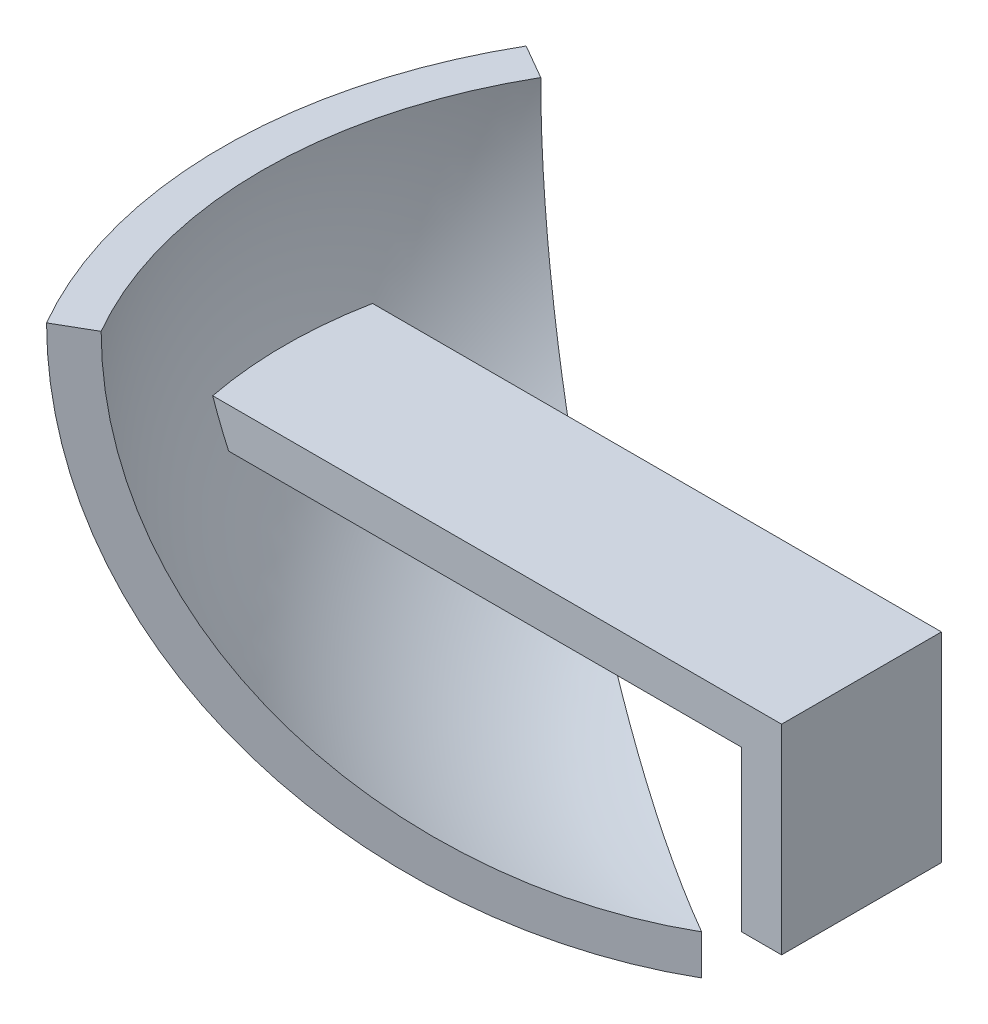
ISO-10303-21;
HEADER;
FILE_DESCRIPTION(('STEP AP214'),'2;1');
FILE_NAME('part.step','',(''),(''),'','','');
FILE_SCHEMA(('AUTOMOTIVE_DESIGN { 1 0 10303 214 1 1 1 1 }'));
ENDSEC;
DATA;
#1=APPLICATION_CONTEXT('core data for automotive mechanical design processes');
#2=APPLICATION_PROTOCOL_DEFINITION('international standard','automotive_design',2000,#1);
#3=PRODUCT_CONTEXT('',#1,'mechanical');
#4=PRODUCT('Part','Part','',(#3));
#5=PRODUCT_RELATED_PRODUCT_CATEGORY('part','',(#4));
#6=PRODUCT_DEFINITION_FORMATION('','',#4);
#7=PRODUCT_DEFINITION_CONTEXT('part definition',#1,'design');
#8=PRODUCT_DEFINITION('design','',#6,#7);
#9=PRODUCT_DEFINITION_SHAPE('','',#8);
#10=(LENGTH_UNIT() NAMED_UNIT(*) SI_UNIT(.MILLI.,.METRE.));
#11=(NAMED_UNIT(*) PLANE_ANGLE_UNIT() SI_UNIT($,.RADIAN.));
#12=(NAMED_UNIT(*) SI_UNIT($,.STERADIAN.) SOLID_ANGLE_UNIT());
#13=UNCERTAINTY_MEASURE_WITH_UNIT(LENGTH_MEASURE(1.E-05),#10,'distance_accuracy_value','');
#14=(GEOMETRIC_REPRESENTATION_CONTEXT(3) GLOBAL_UNCERTAINTY_ASSIGNED_CONTEXT((#13)) GLOBAL_UNIT_ASSIGNED_CONTEXT((#10,
#11,#12)) REPRESENTATION_CONTEXT('',''));
#15=CARTESIAN_POINT('',(0.,0.,0.));
#16=DIRECTION('',(0.,0.,1.));
#17=DIRECTION('',(1.,0.,0.));
#18=AXIS2_PLACEMENT_3D('',#15,#16,#17);
#19=CARTESIAN_POINT('',(25.4,-28.575,12.7000000000001));
#20=DIRECTION('',(0.,1.,0.));
#21=DIRECTION('',(0.,0.,1.));
#22=AXIS2_PLACEMENT_3D('',#19,#20,#21);
#23=PLANE('',#22);
#24=DIRECTION('',(0.,0.,-1.));
#25=VECTOR('',#24,1.);
#26=CARTESIAN_POINT('',(19.05,-28.575,12.7000000000001));
#27=LINE('',#26,#25);
#28=CARTESIAN_POINT('',(19.05,-28.575,12.7000000000001));
#29=VERTEX_POINT('',#28);
#30=CARTESIAN_POINT('',(19.05,-28.575,-12.6999999999999));
#31=VERTEX_POINT('',#30);
#32=EDGE_CURVE('E129',#29,#31,#27,.T.);
#33=ORIENTED_EDGE('',*,*,#32,.F.);
#34=DIRECTION('',(-1.,0.,0.));
#35=VECTOR('',#34,1.);
#36=CARTESIAN_POINT('',(25.4,-28.575,12.7000000000001));
#37=LINE('',#36,#35);
#38=CARTESIAN_POINT('',(-62.4596019439765,-28.575,12.7000000000001));
#39=VERTEX_POINT('',#38);
#40=EDGE_CURVE('E47',#29,#39,#37,.T.);
#41=ORIENTED_EDGE('',*,*,#40,.T.);
#42=CARTESIAN_POINT('',(0.,-28.575,0.));
#43=DIRECTION('',(0.,1.,0.));
#44=DIRECTION('',(0.,0.,1.));
#45=AXIS2_PLACEMENT_3D('',#42,#43,#44);
#46=CIRCLE('',#45,63.737680182134);
#47=CARTESIAN_POINT('',(-62.4596019439766,-28.575,-12.6999999999999));
#48=VERTEX_POINT('',#47);
#49=EDGE_CURVE('E149',#48,#39,#46,.T.);
#50=ORIENTED_EDGE('',*,*,#49,.F.);
#51=DIRECTION('',(-1.,0.,0.));
#52=VECTOR('',#51,1.);
#53=CARTESIAN_POINT('',(25.4,-28.575,-12.6999999999999));
#54=LINE('',#53,#52);
#55=EDGE_CURVE('E115',#31,#48,#54,.T.);
#56=ORIENTED_EDGE('',*,*,#55,.F.);
#57=EDGE_LOOP('',(#33,#41,#50,#56));
#58=FACE_BOUND('',#57,.T.);
#59=ADVANCED_FACE('F32',(#58),#23,.F.);
#60=CARTESIAN_POINT('',(0.,0.,0.));
#61=DIRECTION('',(0.,1.,0.));
#62=DIRECTION('',(-0.866025403784438,0.,-0.500000000000001));
#63=AXIS2_PLACEMENT_3D('',#60,#61,#62);
#64=SPHERICAL_SURFACE('',#63,69.85);
#65=CARTESIAN_POINT('',(0.,0.,0.));
#66=DIRECTION('',(0.,1.,0.));
#67=DIRECTION('',(0.,0.,1.));
#68=AXIS2_PLACEMENT_3D('',#65,#66,#67);
#69=CIRCLE('',#68,69.85);
#70=CARTESIAN_POINT('',(-60.491874454343,0.,-34.9250000000001));
#71=VERTEX_POINT('',#70);
#72=CARTESIAN_POINT('',(-60.491874454343,0.,34.9250000000001));
#73=VERTEX_POINT('',#72);
#74=EDGE_CURVE('E11',#71,#73,#69,.T.);
#75=ORIENTED_EDGE('',*,*,#74,.T.);
#76=CARTESIAN_POINT('',(0.,0.,0.));
#77=DIRECTION('',(-0.500000000000001,0.,-0.866025403784438));
#78=DIRECTION('',(0.866025403784438,0.,-0.500000000000001));
#79=AXIS2_PLACEMENT_3D('',#76,#77,#78);
#80=CIRCLE('',#79,69.85);
#81=CARTESIAN_POINT('',(0.,-69.85,0.));
#82=VERTEX_POINT('',#81);
#83=EDGE_CURVE('E54',#82,#73,#80,.T.);
#84=ORIENTED_EDGE('',*,*,#83,.F.);
#85=CARTESIAN_POINT('',(0.,0.,0.));
#86=DIRECTION('',(0.500000000000001,0.,-0.866025403784438));
#87=DIRECTION('',(0.866025403784438,0.,0.500000000000001));
#88=AXIS2_PLACEMENT_3D('',#85,#86,#87);
#89=CIRCLE('',#88,69.85);
#90=EDGE_CURVE('E168',#82,#71,#89,.T.);
#91=ORIENTED_EDGE('',*,*,#90,.T.);
#92=EDGE_LOOP('',(#75,#84,#91));
#93=FACE_BOUND('',#92,.T.);
#94=CARTESIAN_POINT('',(0.,-22.225,0.));
#95=DIRECTION('',(0.,-1.,0.));
#96=DIRECTION('',(0.,0.,-1.));
#97=AXIS2_PLACEMENT_3D('',#94,#95,#96);
#98=CIRCLE('',#97,66.2198752264001);
#99=CARTESIAN_POINT('',(-64.9906291322064,-22.225,12.7000000000001));
#100=VERTEX_POINT('',#99);
#101=CARTESIAN_POINT('',(-64.9906291322065,-22.225,-12.6999999999999));
#102=VERTEX_POINT('',#101);
#103=EDGE_CURVE('E155',#100,#102,#98,.T.);
#104=ORIENTED_EDGE('',*,*,#103,.T.);
#105=CARTESIAN_POINT('',(0.,0.,-12.6999999999999));
#106=DIRECTION('',(0.,0.,1.));
#107=DIRECTION('',(1.,0.,0.));
#108=AXIS2_PLACEMENT_3D('',#105,#106,#107);
#109=CIRCLE('',#108,68.685751797589);
#110=EDGE_CURVE('E158',#102,#48,#109,.T.);
#111=ORIENTED_EDGE('',*,*,#110,.T.);
#112=ORIENTED_EDGE('',*,*,#49,.T.);
#113=CARTESIAN_POINT('',(0.,0.,12.7000000000001));
#114=DIRECTION('',(0.,0.,-1.));
#115=DIRECTION('',(-1.,0.,0.));
#116=AXIS2_PLACEMENT_3D('',#113,#114,#115);
#117=CIRCLE('',#116,68.685751797589);
#118=EDGE_CURVE('E152',#39,#100,#117,.T.);
#119=ORIENTED_EDGE('',*,*,#118,.T.);
#120=EDGE_LOOP('',(#104,#111,#112,#119));
#121=FACE_BOUND('',#120,.T.);
#122=ADVANCED_FACE('F189',(#93,#121),#64,.F.);
#123=CARTESIAN_POINT('',(0.,0.,0.));
#124=DIRECTION('',(0.,1.,0.));
#125=DIRECTION('',(-0.866025403784438,0.,-0.500000000000001));
#126=AXIS2_PLACEMENT_3D('',#123,#124,#125);
#127=SPHERICAL_SURFACE('',#126,76.2);
#128=CARTESIAN_POINT('',(0.,0.,0.));
#129=DIRECTION('',(0.500000000000001,0.,0.866025403784438));
#130=DIRECTION('',(0.866025403784438,0.,-0.500000000000001));
#131=AXIS2_PLACEMENT_3D('',#128,#129,#130);
#132=CIRCLE('',#131,76.2);
#133=CARTESIAN_POINT('',(-65.9911357683742,0.,38.1000000000001));
#134=VERTEX_POINT('',#133);
#135=CARTESIAN_POINT('',(0.,-76.2,0.));
#136=VERTEX_POINT('',#135);
#137=EDGE_CURVE('E165',#134,#136,#132,.T.);
#138=ORIENTED_EDGE('',*,*,#137,.F.);
#139=CARTESIAN_POINT('',(0.,0.,0.));
#140=DIRECTION('',(0.,1.,0.));
#141=DIRECTION('',(0.,0.,1.));
#142=AXIS2_PLACEMENT_3D('',#139,#140,#141);
#143=CIRCLE('',#142,76.2);
#144=CARTESIAN_POINT('',(-65.9911357683742,0.,-38.1000000000001));
#145=VERTEX_POINT('',#144);
#146=EDGE_CURVE('E40',#145,#134,#143,.T.);
#147=ORIENTED_EDGE('',*,*,#146,.F.);
#148=CARTESIAN_POINT('',(0.,0.,0.));
#149=DIRECTION('',(-0.500000000000001,0.,0.866025403784438));
#150=DIRECTION('',(0.866025403784438,0.,0.500000000000001));
#151=AXIS2_PLACEMENT_3D('',#148,#149,#150);
#152=CIRCLE('',#151,76.2);
#153=EDGE_CURVE('E173',#145,#136,#152,.T.);
#154=ORIENTED_EDGE('',*,*,#153,.T.);
#155=EDGE_LOOP('',(#138,#147,#154));
#156=FACE_BOUND('',#155,.T.);
#157=ADVANCED_FACE('F186',(#156),#127,.T.);
#158=CARTESIAN_POINT('',(-60.491874454343,0.,-34.9250000000001));
#159=DIRECTION('',(0.,1.,0.));
#160=DIRECTION('',(0.,0.,1.));
#161=AXIS2_PLACEMENT_3D('',#158,#159,#160);
#162=PLANE('',#161);
#163=ORIENTED_EDGE('',*,*,#146,.T.);
#164=DIRECTION('',(-0.866025403784438,0.,0.500000000000001));
#165=VECTOR('',#164,1.);
#166=CARTESIAN_POINT('',(-60.491874454343,0.,34.9250000000001));
#167=LINE('',#166,#165);
#168=EDGE_CURVE('E162',#73,#134,#167,.T.);
#169=ORIENTED_EDGE('',*,*,#168,.F.);
#170=ORIENTED_EDGE('',*,*,#74,.F.);
#171=DIRECTION('',(-0.866025403784438,0.,-0.500000000000001));
#172=VECTOR('',#171,1.);
#173=CARTESIAN_POINT('',(-60.491874454343,0.,-34.9250000000001));
#174=LINE('',#173,#172);
#175=EDGE_CURVE('E170',#71,#145,#174,.T.);
#176=ORIENTED_EDGE('',*,*,#175,.T.);
#177=EDGE_LOOP('',(#163,#169,#170,#176));
#178=FACE_BOUND('',#177,.T.);
#179=ADVANCED_FACE('F34',(#178),#162,.T.);
#180=CARTESIAN_POINT('',(0.,0.,0.));
#181=DIRECTION('',(-0.500000000000001,0.,0.866025403784438));
#182=DIRECTION('',(0.866025403784438,0.,0.500000000000001));
#183=AXIS2_PLACEMENT_3D('',#180,#181,#182);
#184=PLANE('',#183);
#185=ORIENTED_EDGE('',*,*,#90,.F.);
#186=DIRECTION('',(0.,1.,0.));
#187=VECTOR('',#186,1.);
#188=CARTESIAN_POINT('',(0.,-69.85,0.));
#189=LINE('',#188,#187);
#190=EDGE_CURVE('E176',#136,#82,#189,.T.);
#191=ORIENTED_EDGE('',*,*,#190,.F.);
#192=ORIENTED_EDGE('',*,*,#153,.F.);
#193=ORIENTED_EDGE('',*,*,#175,.F.);
#194=EDGE_LOOP('',(#185,#191,#192,#193));
#195=FACE_BOUND('',#194,.T.);
#196=ADVANCED_FACE('F188',(#195),#184,.F.);
#197=CARTESIAN_POINT('',(0.,0.,0.));
#198=DIRECTION('',(0.500000000000001,0.,0.866025403784438));
#199=DIRECTION('',(0.866025403784438,0.,-0.500000000000001));
#200=AXIS2_PLACEMENT_3D('',#197,#198,#199);
#201=PLANE('',#200);
#202=ORIENTED_EDGE('',*,*,#83,.T.);
#203=ORIENTED_EDGE('',*,*,#168,.T.);
#204=ORIENTED_EDGE('',*,*,#137,.T.);
#205=ORIENTED_EDGE('',*,*,#190,.T.);
#206=EDGE_LOOP('',(#202,#203,#204,#205));
#207=FACE_BOUND('',#206,.T.);
#208=ADVANCED_FACE('F185',(#207),#201,.T.);
#209=CARTESIAN_POINT('',(25.4,-28.575,-12.6999999999999));
#210=DIRECTION('',(0.,0.,1.));
#211=DIRECTION('',(1.,0.,0.));
#212=AXIS2_PLACEMENT_3D('',#209,#210,#211);
#213=PLANE('',#212);
#214=ORIENTED_EDGE('',*,*,#110,.F.);
#215=DIRECTION('',(-1.,0.,0.));
#216=VECTOR('',#215,1.);
#217=CARTESIAN_POINT('',(25.4,-22.225,-12.6999999999999));
#218=LINE('',#217,#216);
#219=CARTESIAN_POINT('',(25.4,-22.225,-12.6999999999999));
#220=VERTEX_POINT('',#219);
#221=EDGE_CURVE('E146',#220,#102,#218,.T.);
#222=ORIENTED_EDGE('',*,*,#221,.F.);
#223=DIRECTION('',(0.,1.,0.));
#224=VECTOR('',#223,1.);
#225=CARTESIAN_POINT('',(25.4,-28.575,-12.6999999999999));
#226=LINE('',#225,#224);
#227=CARTESIAN_POINT('',(25.4,-53.975,-12.6999999999999));
#228=VERTEX_POINT('',#227);
#229=EDGE_CURVE('E139',#228,#220,#226,.T.);
#230=ORIENTED_EDGE('',*,*,#229,.F.);
#231=DIRECTION('',(1.,0.,0.));
#232=VECTOR('',#231,1.);
#233=CARTESIAN_POINT('',(25.4,-53.975,-12.6999999999999));
#234=LINE('',#233,#232);
#235=CARTESIAN_POINT('',(19.05,-53.975,-12.6999999999999));
#236=VERTEX_POINT('',#235);
#237=EDGE_CURVE('E128',#236,#228,#234,.T.);
#238=ORIENTED_EDGE('',*,*,#237,.F.);
#239=DIRECTION('',(0.,1.,0.));
#240=VECTOR('',#239,1.);
#241=CARTESIAN_POINT('',(19.05,-53.975,-12.6999999999999));
#242=LINE('',#241,#240);
#243=EDGE_CURVE('E134',#236,#31,#242,.T.);
#244=ORIENTED_EDGE('',*,*,#243,.T.);
#245=ORIENTED_EDGE('',*,*,#55,.T.);
#246=EDGE_LOOP('',(#214,#222,#230,#238,#244,#245));
#247=FACE_BOUND('',#246,.T.);
#248=ADVANCED_FACE('F198',(#247),#213,.F.);
#249=CARTESIAN_POINT('',(25.4,-22.225,12.7000000000001));
#250=DIRECTION('',(0.,-1.,0.));
#251=DIRECTION('',(0.,0.,-1.));
#252=AXIS2_PLACEMENT_3D('',#249,#250,#251);
#253=PLANE('',#252);
#254=ORIENTED_EDGE('',*,*,#103,.F.);
#255=DIRECTION('',(-1.,0.,0.));
#256=VECTOR('',#255,1.);
#257=CARTESIAN_POINT('',(25.4,-22.225,12.7000000000001));
#258=LINE('',#257,#256);
#259=CARTESIAN_POINT('',(25.4,-22.225,12.7000000000001));
#260=VERTEX_POINT('',#259);
#261=EDGE_CURVE('E144',#260,#100,#258,.T.);
#262=ORIENTED_EDGE('',*,*,#261,.F.);
#263=DIRECTION('',(0.,0.,1.));
#264=VECTOR('',#263,1.);
#265=CARTESIAN_POINT('',(25.4,-22.225,12.7000000000001));
#266=LINE('',#265,#264);
#267=EDGE_CURVE('E111',#220,#260,#266,.T.);
#268=ORIENTED_EDGE('',*,*,#267,.F.);
#269=ORIENTED_EDGE('',*,*,#221,.T.);
#270=EDGE_LOOP('',(#254,#262,#268,#269));
#271=FACE_BOUND('',#270,.T.);
#272=ADVANCED_FACE('F194',(#271),#253,.F.);
#273=CARTESIAN_POINT('',(25.4,-28.575,12.7000000000001));
#274=DIRECTION('',(0.,0.,-1.));
#275=DIRECTION('',(-1.,0.,0.));
#276=AXIS2_PLACEMENT_3D('',#273,#274,#275);
#277=PLANE('',#276);
#278=ORIENTED_EDGE('',*,*,#118,.F.);
#279=ORIENTED_EDGE('',*,*,#40,.F.);
#280=DIRECTION('',(0.,1.,0.));
#281=VECTOR('',#280,1.);
#282=CARTESIAN_POINT('',(19.05,-53.975,12.7000000000001));
#283=LINE('',#282,#281);
#284=CARTESIAN_POINT('',(19.05,-53.975,12.7000000000001));
#285=VERTEX_POINT('',#284);
#286=EDGE_CURVE('E120',#285,#29,#283,.T.);
#287=ORIENTED_EDGE('',*,*,#286,.F.);
#288=DIRECTION('',(-1.,0.,0.));
#289=VECTOR('',#288,1.);
#290=CARTESIAN_POINT('',(25.4,-53.975,12.7000000000001));
#291=LINE('',#290,#289);
#292=CARTESIAN_POINT('',(25.4,-53.975,12.7000000000001));
#293=VERTEX_POINT('',#292);
#294=EDGE_CURVE('E118',#293,#285,#291,.T.);
#295=ORIENTED_EDGE('',*,*,#294,.F.);
#296=DIRECTION('',(0.,-1.,0.));
#297=VECTOR('',#296,1.);
#298=CARTESIAN_POINT('',(25.4,-28.575,12.7000000000001));
#299=LINE('',#298,#297);
#300=EDGE_CURVE('E105',#260,#293,#299,.T.);
#301=ORIENTED_EDGE('',*,*,#300,.F.);
#302=ORIENTED_EDGE('',*,*,#261,.T.);
#303=EDGE_LOOP('',(#278,#279,#287,#295,#301,#302));
#304=FACE_BOUND('',#303,.T.);
#305=ADVANCED_FACE('F119',(#304),#277,.F.);
#306=CARTESIAN_POINT('',(25.4,0.,0.));
#307=DIRECTION('',(-1.,0.,0.));
#308=DIRECTION('',(0.,0.,1.));
#309=AXIS2_PLACEMENT_3D('',#306,#307,#308);
#310=PLANE('',#309);
#311=ORIENTED_EDGE('',*,*,#229,.T.);
#312=ORIENTED_EDGE('',*,*,#267,.T.);
#313=ORIENTED_EDGE('',*,*,#300,.T.);
#314=DIRECTION('',(0.,0.,1.));
#315=VECTOR('',#314,1.);
#316=CARTESIAN_POINT('',(25.4,-53.975,12.7000000000001));
#317=LINE('',#316,#315);
#318=EDGE_CURVE('E110',#228,#293,#317,.T.);
#319=ORIENTED_EDGE('',*,*,#318,.F.);
#320=EDGE_LOOP('',(#311,#312,#313,#319));
#321=FACE_BOUND('',#320,.T.);
#322=ADVANCED_FACE('F108',(#321),#310,.F.);
#323=CARTESIAN_POINT('',(19.05,-53.975,12.7000000000001));
#324=DIRECTION('',(1.,0.,0.));
#325=DIRECTION('',(0.,0.,-1.));
#326=AXIS2_PLACEMENT_3D('',#323,#324,#325);
#327=PLANE('',#326);
#328=ORIENTED_EDGE('',*,*,#32,.T.);
#329=ORIENTED_EDGE('',*,*,#243,.F.);
#330=DIRECTION('',(0.,0.,-1.));
#331=VECTOR('',#330,1.);
#332=CARTESIAN_POINT('',(19.05,-53.975,12.7000000000001));
#333=LINE('',#332,#331);
#334=EDGE_CURVE('E123',#285,#236,#333,.T.);
#335=ORIENTED_EDGE('',*,*,#334,.F.);
#336=ORIENTED_EDGE('',*,*,#286,.T.);
#337=EDGE_LOOP('',(#328,#329,#335,#336));
#338=FACE_BOUND('',#337,.T.);
#339=ADVANCED_FACE('F201',(#338),#327,.F.);
#340=CARTESIAN_POINT('',(0.,-53.975,0.));
#341=DIRECTION('',(0.,1.,0.));
#342=DIRECTION('',(0.,0.,1.));
#343=AXIS2_PLACEMENT_3D('',#340,#341,#342);
#344=PLANE('',#343);
#345=ORIENTED_EDGE('',*,*,#318,.T.);
#346=ORIENTED_EDGE('',*,*,#294,.T.);
#347=ORIENTED_EDGE('',*,*,#334,.T.);
#348=ORIENTED_EDGE('',*,*,#237,.T.);
#349=EDGE_LOOP('',(#345,#346,#347,#348));
#350=FACE_BOUND('',#349,.T.);
#351=ADVANCED_FACE('F126',(#350),#344,.F.);
#352=CLOSED_SHELL('',(#59,#122,#157,#179,#196,#208,#248,#272,#305,#322,#339,#351));
#353=MANIFOLD_SOLID_BREP('B2',#352);
#354=ADVANCED_BREP_SHAPE_REPRESENTATION('',(#18,#353),#14);
#355=SHAPE_DEFINITION_REPRESENTATION(#9,#354);
ENDSEC;
END-ISO-10303-21;
